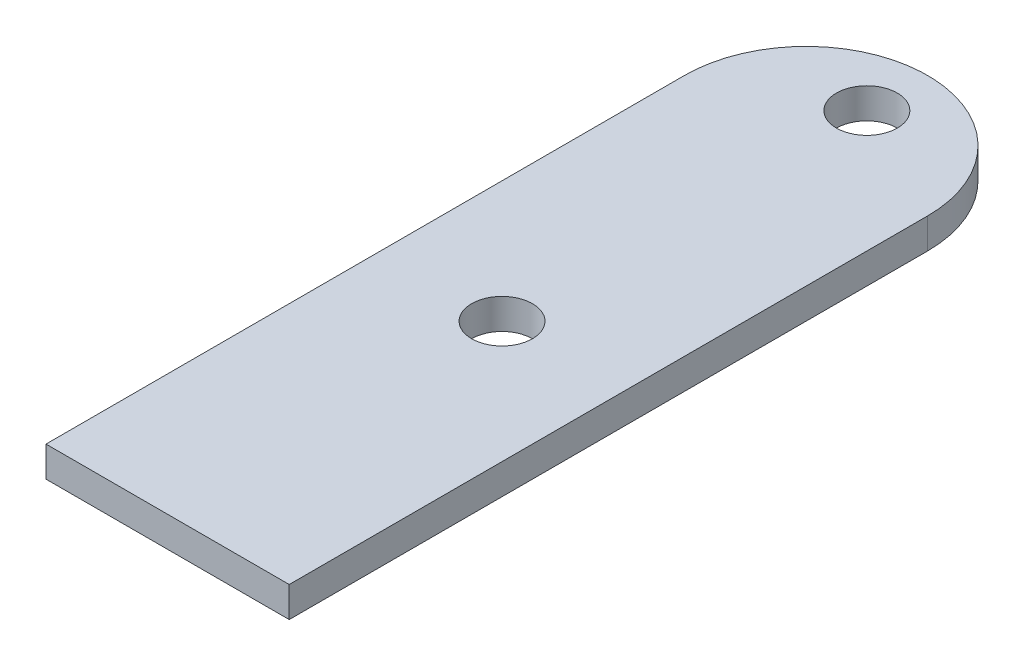
ISO-10303-21;
HEADER;
FILE_DESCRIPTION(('STEP AP214'),'2;1');
FILE_NAME('part.step','',(''),(''),'','','');
FILE_SCHEMA(('AUTOMOTIVE_DESIGN { 1 0 10303 214 1 1 1 1 }'));
ENDSEC;
DATA;
#1=APPLICATION_CONTEXT('core data for automotive mechanical design processes');
#2=APPLICATION_PROTOCOL_DEFINITION('international standard','automotive_design',2000,#1);
#3=PRODUCT_CONTEXT('',#1,'mechanical');
#4=PRODUCT('Part','Part','',(#3));
#5=PRODUCT_RELATED_PRODUCT_CATEGORY('part','',(#4));
#6=PRODUCT_DEFINITION_FORMATION('','',#4);
#7=PRODUCT_DEFINITION_CONTEXT('part definition',#1,'design');
#8=PRODUCT_DEFINITION('design','',#6,#7);
#9=PRODUCT_DEFINITION_SHAPE('','',#8);
#10=(LENGTH_UNIT() NAMED_UNIT(*) SI_UNIT(.MILLI.,.METRE.));
#11=(NAMED_UNIT(*) PLANE_ANGLE_UNIT() SI_UNIT($,.RADIAN.));
#12=(NAMED_UNIT(*) SI_UNIT($,.STERADIAN.) SOLID_ANGLE_UNIT());
#13=UNCERTAINTY_MEASURE_WITH_UNIT(LENGTH_MEASURE(1.E-05),#10,'distance_accuracy_value','');
#14=(GEOMETRIC_REPRESENTATION_CONTEXT(3) GLOBAL_UNCERTAINTY_ASSIGNED_CONTEXT((#13)) GLOBAL_UNIT_ASSIGNED_CONTEXT((#10,
#11,#12)) REPRESENTATION_CONTEXT('',''));
#15=CARTESIAN_POINT('',(0.,0.,0.));
#16=DIRECTION('',(0.,0.,1.));
#17=DIRECTION('',(1.,0.,0.));
#18=AXIS2_PLACEMENT_3D('',#15,#16,#17);
#19=CARTESIAN_POINT('',(12.7,3.175,-66.675));
#20=DIRECTION('',(0.,-1.,0.));
#21=DIRECTION('',(0.,0.,-1.));
#22=AXIS2_PLACEMENT_3D('',#19,#20,#21);
#23=CYLINDRICAL_SURFACE('',#22,12.7);
#24=DIRECTION('',(0.,-1.,0.));
#25=VECTOR('',#24,1.);
#26=CARTESIAN_POINT('',(0.,3.175,-66.675));
#27=LINE('',#26,#25);
#28=CARTESIAN_POINT('',(0.,3.175,-66.675));
#29=VERTEX_POINT('',#28);
#30=CARTESIAN_POINT('',(0.,0.,-66.675));
#31=VERTEX_POINT('',#30);
#32=EDGE_CURVE('E103',#29,#31,#27,.T.);
#33=ORIENTED_EDGE('',*,*,#32,.F.);
#34=CARTESIAN_POINT('',(12.7,3.175,-66.675));
#35=DIRECTION('',(0.,-1.,0.));
#36=DIRECTION('',(0.,0.,-1.));
#37=AXIS2_PLACEMENT_3D('',#34,#35,#36);
#38=CIRCLE('',#37,12.7);
#39=CARTESIAN_POINT('',(25.4,3.175,-66.675));
#40=VERTEX_POINT('',#39);
#41=EDGE_CURVE('E49',#40,#29,#38,.F.);
#42=ORIENTED_EDGE('',*,*,#41,.F.);
#43=DIRECTION('',(0.,-1.,0.));
#44=VECTOR('',#43,1.);
#45=CARTESIAN_POINT('',(25.4,3.175,-66.675));
#46=LINE('',#45,#44);
#47=CARTESIAN_POINT('',(25.4,0.,-66.675));
#48=VERTEX_POINT('',#47);
#49=EDGE_CURVE('E105',#48,#40,#46,.F.);
#50=ORIENTED_EDGE('',*,*,#49,.F.);
#51=CARTESIAN_POINT('',(12.7,0.,-66.675));
#52=DIRECTION('',(0.,-1.,0.));
#53=DIRECTION('',(0.,0.,-1.));
#54=AXIS2_PLACEMENT_3D('',#51,#52,#53);
#55=CIRCLE('',#54,12.7);
#56=EDGE_CURVE('E11',#31,#48,#55,.T.);
#57=ORIENTED_EDGE('',*,*,#56,.F.);
#58=EDGE_LOOP('',(#33,#42,#50,#57));
#59=FACE_BOUND('',#58,.T.);
#60=ADVANCED_FACE('F41',(#59),#23,.T.);
#61=CARTESIAN_POINT('',(0.,3.175,0.));
#62=DIRECTION('',(0.,-1.,0.));
#63=DIRECTION('',(0.,0.,-1.));
#64=AXIS2_PLACEMENT_3D('',#61,#62,#63);
#65=PLANE('',#64);
#66=DIRECTION('',(0.,0.,-1.));
#67=VECTOR('',#66,1.);
#68=CARTESIAN_POINT('',(25.4,3.175,0.));
#69=LINE('',#68,#67);
#70=CARTESIAN_POINT('',(25.4,3.175,0.));
#71=VERTEX_POINT('',#70);
#72=EDGE_CURVE('E98',#71,#40,#69,.T.);
#73=ORIENTED_EDGE('',*,*,#72,.T.);
#74=ORIENTED_EDGE('',*,*,#41,.T.);
#75=DIRECTION('',(0.,0.,1.));
#76=VECTOR('',#75,1.);
#77=CARTESIAN_POINT('',(0.,3.175,0.));
#78=LINE('',#77,#76);
#79=CARTESIAN_POINT('',(0.,3.175,0.));
#80=VERTEX_POINT('',#79);
#81=EDGE_CURVE('E79',#29,#80,#78,.T.);
#82=ORIENTED_EDGE('',*,*,#81,.T.);
#83=DIRECTION('',(1.,0.,0.));
#84=VECTOR('',#83,1.);
#85=CARTESIAN_POINT('',(0.,3.175,0.));
#86=LINE('',#85,#84);
#87=EDGE_CURVE('E84',#80,#71,#86,.T.);
#88=ORIENTED_EDGE('',*,*,#87,.T.);
#89=EDGE_LOOP('',(#73,#74,#82,#88));
#90=FACE_BOUND('',#89,.T.);
#91=CARTESIAN_POINT('',(12.7,3.175,-73.025));
#92=DIRECTION('',(0.,1.,0.));
#93=DIRECTION('',(0.,0.,1.));
#94=AXIS2_PLACEMENT_3D('',#91,#92,#93);
#95=CIRCLE('',#94,3.175);
#96=CARTESIAN_POINT('',(12.7,3.175,-69.85));
#97=VERTEX_POINT('',#96);
#98=EDGE_CURVE('E117',#97,#97,#95,.T.);
#99=ORIENTED_EDGE('',*,*,#98,.F.);
#100=EDGE_LOOP('',(#99));
#101=FACE_BOUND('',#100,.T.);
#102=CARTESIAN_POINT('',(12.7,3.175,-34.925));
#103=DIRECTION('',(0.,1.,0.));
#104=DIRECTION('',(0.,0.,1.));
#105=AXIS2_PLACEMENT_3D('',#102,#103,#104);
#106=CIRCLE('',#105,3.175);
#107=CARTESIAN_POINT('',(12.7,3.175,-31.75));
#108=VERTEX_POINT('',#107);
#109=EDGE_CURVE('E127',#108,#108,#106,.T.);
#110=ORIENTED_EDGE('',*,*,#109,.F.);
#111=EDGE_LOOP('',(#110));
#112=FACE_BOUND('',#111,.T.);
#113=ADVANCED_FACE('F82',(#90,#101,#112),#65,.F.);
#114=CARTESIAN_POINT('',(0.,0.,0.));
#115=DIRECTION('',(0.,-1.,0.));
#116=DIRECTION('',(0.,0.,-1.));
#117=AXIS2_PLACEMENT_3D('',#114,#115,#116);
#118=PLANE('',#117);
#119=CARTESIAN_POINT('',(12.7,0.,-73.025));
#120=DIRECTION('',(0.,1.,0.));
#121=DIRECTION('',(0.,0.,1.));
#122=AXIS2_PLACEMENT_3D('',#119,#120,#121);
#123=CIRCLE('',#122,3.175);
#124=CARTESIAN_POINT('',(12.7,0.,-69.85));
#125=VERTEX_POINT('',#124);
#126=EDGE_CURVE('E130',#125,#125,#123,.T.);
#127=ORIENTED_EDGE('',*,*,#126,.T.);
#128=EDGE_LOOP('',(#127));
#129=FACE_BOUND('',#128,.T.);
#130=DIRECTION('',(0.,0.,1.));
#131=VECTOR('',#130,1.);
#132=CARTESIAN_POINT('',(0.,0.,0.));
#133=LINE('',#132,#131);
#134=CARTESIAN_POINT('',(0.,0.,0.));
#135=VERTEX_POINT('',#134);
#136=EDGE_CURVE('E101',#31,#135,#133,.T.);
#137=ORIENTED_EDGE('',*,*,#136,.F.);
#138=ORIENTED_EDGE('',*,*,#56,.T.);
#139=DIRECTION('',(0.,0.,-1.));
#140=VECTOR('',#139,1.);
#141=CARTESIAN_POINT('',(25.4,0.,0.));
#142=LINE('',#141,#140);
#143=CARTESIAN_POINT('',(25.4,0.,0.));
#144=VERTEX_POINT('',#143);
#145=EDGE_CURVE('E89',#144,#48,#142,.T.);
#146=ORIENTED_EDGE('',*,*,#145,.F.);
#147=DIRECTION('',(1.,0.,0.));
#148=VECTOR('',#147,1.);
#149=CARTESIAN_POINT('',(0.,0.,0.));
#150=LINE('',#149,#148);
#151=EDGE_CURVE('E116',#135,#144,#150,.T.);
#152=ORIENTED_EDGE('',*,*,#151,.F.);
#153=EDGE_LOOP('',(#137,#138,#146,#152));
#154=FACE_BOUND('',#153,.T.);
#155=CARTESIAN_POINT('',(12.7,0.,-34.925));
#156=DIRECTION('',(0.,1.,0.));
#157=DIRECTION('',(0.,0.,1.));
#158=AXIS2_PLACEMENT_3D('',#155,#156,#157);
#159=CIRCLE('',#158,3.175);
#160=CARTESIAN_POINT('',(12.7,0.,-31.75));
#161=VERTEX_POINT('',#160);
#162=EDGE_CURVE('E125',#161,#161,#159,.T.);
#163=ORIENTED_EDGE('',*,*,#162,.T.);
#164=EDGE_LOOP('',(#163));
#165=FACE_BOUND('',#164,.T.);
#166=ADVANCED_FACE('F118',(#129,#154,#165),#118,.T.);
#167=CARTESIAN_POINT('',(0.,3.175,0.));
#168=DIRECTION('',(1.,0.,0.));
#169=DIRECTION('',(0.,0.,-1.));
#170=AXIS2_PLACEMENT_3D('',#167,#168,#169);
#171=PLANE('',#170);
#172=ORIENTED_EDGE('',*,*,#81,.F.);
#173=ORIENTED_EDGE('',*,*,#32,.T.);
#174=ORIENTED_EDGE('',*,*,#136,.T.);
#175=DIRECTION('',(0.,-1.,0.));
#176=VECTOR('',#175,1.);
#177=CARTESIAN_POINT('',(0.,3.175,0.));
#178=LINE('',#177,#176);
#179=EDGE_CURVE('E94',#80,#135,#178,.T.);
#180=ORIENTED_EDGE('',*,*,#179,.F.);
#181=EDGE_LOOP('',(#172,#173,#174,#180));
#182=FACE_BOUND('',#181,.T.);
#183=ADVANCED_FACE('F100',(#182),#171,.F.);
#184=CARTESIAN_POINT('',(0.,3.175,0.));
#185=DIRECTION('',(0.,0.,-1.));
#186=DIRECTION('',(-1.,0.,0.));
#187=AXIS2_PLACEMENT_3D('',#184,#185,#186);
#188=PLANE('',#187);
#189=ORIENTED_EDGE('',*,*,#151,.T.);
#190=DIRECTION('',(0.,-1.,0.));
#191=VECTOR('',#190,1.);
#192=CARTESIAN_POINT('',(25.4,3.175,0.));
#193=LINE('',#192,#191);
#194=EDGE_CURVE('E96',#71,#144,#193,.T.);
#195=ORIENTED_EDGE('',*,*,#194,.F.);
#196=ORIENTED_EDGE('',*,*,#87,.F.);
#197=ORIENTED_EDGE('',*,*,#179,.T.);
#198=EDGE_LOOP('',(#189,#195,#196,#197));
#199=FACE_BOUND('',#198,.T.);
#200=ADVANCED_FACE('F93',(#199),#188,.F.);
#201=CARTESIAN_POINT('',(25.4,3.175,0.));
#202=DIRECTION('',(-1.,0.,0.));
#203=DIRECTION('',(0.,0.,1.));
#204=AXIS2_PLACEMENT_3D('',#201,#202,#203);
#205=PLANE('',#204);
#206=ORIENTED_EDGE('',*,*,#145,.T.);
#207=ORIENTED_EDGE('',*,*,#49,.T.);
#208=ORIENTED_EDGE('',*,*,#72,.F.);
#209=ORIENTED_EDGE('',*,*,#194,.T.);
#210=EDGE_LOOP('',(#206,#207,#208,#209));
#211=FACE_BOUND('',#210,.T.);
#212=ADVANCED_FACE('F112',(#211),#205,.F.);
#213=CARTESIAN_POINT('',(12.7,3.175,-73.025));
#214=DIRECTION('',(0.,-1.,0.));
#215=DIRECTION('',(0.,0.,-1.));
#216=AXIS2_PLACEMENT_3D('',#213,#214,#215);
#217=CYLINDRICAL_SURFACE('',#216,3.175);
#218=ORIENTED_EDGE('',*,*,#98,.T.);
#219=EDGE_LOOP('',(#218));
#220=FACE_BOUND('',#219,.T.);
#221=ORIENTED_EDGE('',*,*,#126,.F.);
#222=EDGE_LOOP('',(#221));
#223=FACE_BOUND('',#222,.T.);
#224=ADVANCED_FACE('F138',(#220,#223),#217,.F.);
#225=CARTESIAN_POINT('',(12.7,3.175,-34.925));
#226=DIRECTION('',(0.,-1.,0.));
#227=DIRECTION('',(0.,0.,-1.));
#228=AXIS2_PLACEMENT_3D('',#225,#226,#227);
#229=CYLINDRICAL_SURFACE('',#228,3.175);
#230=ORIENTED_EDGE('',*,*,#109,.T.);
#231=EDGE_LOOP('',(#230));
#232=FACE_BOUND('',#231,.T.);
#233=ORIENTED_EDGE('',*,*,#162,.F.);
#234=EDGE_LOOP('',(#233));
#235=FACE_BOUND('',#234,.T.);
#236=ADVANCED_FACE('F140',(#232,#235),#229,.F.);
#237=CLOSED_SHELL('',(#60,#113,#166,#183,#200,#212,#224,#236));
#238=MANIFOLD_SOLID_BREP('B2',#237);
#239=ADVANCED_BREP_SHAPE_REPRESENTATION('',(#18,#238),#14);
#240=SHAPE_DEFINITION_REPRESENTATION(#9,#239);
ENDSEC;
END-ISO-10303-21;
